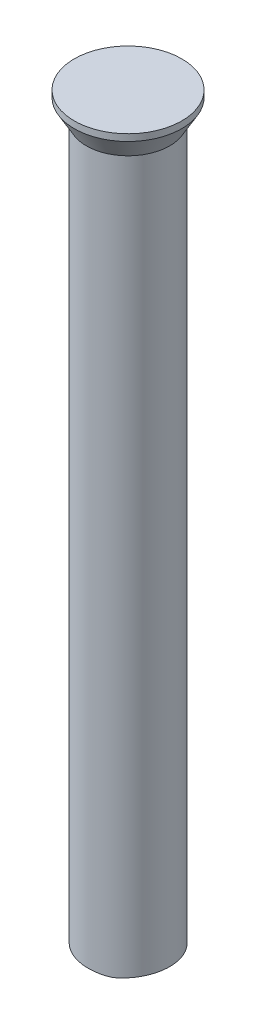
ISO-10303-21;
HEADER;
FILE_DESCRIPTION(('STEP AP214'),'2;1');
FILE_NAME('part.step','',(''),(''),'','','');
FILE_SCHEMA(('AUTOMOTIVE_DESIGN { 1 0 10303 214 1 1 1 1 }'));
ENDSEC;
DATA;
#1=APPLICATION_CONTEXT('core data for automotive mechanical design processes');
#2=APPLICATION_PROTOCOL_DEFINITION('international standard','automotive_design',2000,#1);
#3=PRODUCT_CONTEXT('',#1,'mechanical');
#4=PRODUCT('Part','Part','',(#3));
#5=PRODUCT_RELATED_PRODUCT_CATEGORY('part','',(#4));
#6=PRODUCT_DEFINITION_FORMATION('','',#4);
#7=PRODUCT_DEFINITION_CONTEXT('part definition',#1,'design');
#8=PRODUCT_DEFINITION('design','',#6,#7);
#9=PRODUCT_DEFINITION_SHAPE('','',#8);
#10=(LENGTH_UNIT() NAMED_UNIT(*) SI_UNIT(.MILLI.,.METRE.));
#11=(NAMED_UNIT(*) PLANE_ANGLE_UNIT() SI_UNIT($,.RADIAN.));
#12=(NAMED_UNIT(*) SI_UNIT($,.STERADIAN.) SOLID_ANGLE_UNIT());
#13=UNCERTAINTY_MEASURE_WITH_UNIT(LENGTH_MEASURE(1.E-05),#10,'distance_accuracy_value','');
#14=(GEOMETRIC_REPRESENTATION_CONTEXT(3) GLOBAL_UNCERTAINTY_ASSIGNED_CONTEXT((#13)) GLOBAL_UNIT_ASSIGNED_CONTEXT((#10,
#11,#12)) REPRESENTATION_CONTEXT('',''));
#15=CARTESIAN_POINT('',(0.,0.,0.));
#16=DIRECTION('',(0.,0.,1.));
#17=DIRECTION('',(1.,0.,0.));
#18=AXIS2_PLACEMENT_3D('',#15,#16,#17);
#19=CARTESIAN_POINT('',(0.,0.,0.));
#20=DIRECTION('',(0.,1.,0.));
#21=DIRECTION('',(0.,0.,1.));
#22=AXIS2_PLACEMENT_3D('',#19,#20,#21);
#23=PLANE('',#22);
#24=CARTESIAN_POINT('',(0.,0.,0.));
#25=DIRECTION('',(0.,-1.,0.));
#26=DIRECTION('',(0.,0.,-1.));
#27=AXIS2_PLACEMENT_3D('',#24,#25,#26);
#28=CIRCLE('',#27,4.);
#29=CARTESIAN_POINT('',(0.,0.,-4.));
#30=VERTEX_POINT('',#29);
#31=EDGE_CURVE('E71',#30,#30,#28,.T.);
#32=ORIENTED_EDGE('',*,*,#31,.F.);
#33=EDGE_LOOP('',(#32));
#34=FACE_BOUND('',#33,.T.);
#35=ADVANCED_FACE('F40',(#34),#23,.T.);
#36=CARTESIAN_POINT('',(0.,-60.2,0.));
#37=DIRECTION('',(0.,-1.,0.));
#38=DIRECTION('',(0.,0.,-1.));
#39=AXIS2_PLACEMENT_3D('',#36,#37,#38);
#40=CYLINDRICAL_SURFACE('',#39,4.);
#41=ORIENTED_EDGE('',*,*,#31,.T.);
#42=EDGE_LOOP('',(#41));
#43=FACE_BOUND('',#42,.T.);
#44=CARTESIAN_POINT('',(0.,-0.5,0.));
#45=DIRECTION('',(0.,-1.,0.));
#46=DIRECTION('',(0.,0.,-1.));
#47=AXIS2_PLACEMENT_3D('',#44,#45,#46);
#48=CIRCLE('',#47,4.);
#49=CARTESIAN_POINT('',(0.,-0.5,-4.));
#50=VERTEX_POINT('',#49);
#51=EDGE_CURVE('E80',#50,#50,#48,.T.);
#52=ORIENTED_EDGE('',*,*,#51,.F.);
#53=EDGE_LOOP('',(#52));
#54=FACE_BOUND('',#53,.T.);
#55=ADVANCED_FACE('F90',(#43,#54),#40,.T.);
#56=CARTESIAN_POINT('',(0.,-2.05884572681201,0.));
#57=DIRECTION('',(0.,1.,0.));
#58=DIRECTION('',(0.,0.,1.));
#59=AXIS2_PLACEMENT_3D('',#56,#57,#58);
#60=CONICAL_SURFACE('',#59,3.1,0.523598775598293);
#61=ORIENTED_EDGE('',*,*,#51,.T.);
#62=EDGE_LOOP('',(#61));
#63=FACE_BOUND('',#62,.T.);
#64=CARTESIAN_POINT('',(0.,-2.05884572681201,0.));
#65=DIRECTION('',(0.,-1.,0.));
#66=DIRECTION('',(0.,0.,-1.));
#67=AXIS2_PLACEMENT_3D('',#64,#65,#66);
#68=CIRCLE('',#67,3.1);
#69=CARTESIAN_POINT('',(0.,-2.05884572681201,-3.1));
#70=VERTEX_POINT('',#69);
#71=EDGE_CURVE('E77',#70,#70,#68,.T.);
#72=ORIENTED_EDGE('',*,*,#71,.F.);
#73=EDGE_LOOP('',(#72));
#74=FACE_BOUND('',#73,.T.);
#75=ADVANCED_FACE('F97',(#63,#74),#60,.T.);
#76=CARTESIAN_POINT('',(0.,-60.2,0.));
#77=DIRECTION('',(0.,-1.,0.));
#78=DIRECTION('',(0.,0.,-1.));
#79=AXIS2_PLACEMENT_3D('',#76,#77,#78);
#80=CYLINDRICAL_SURFACE('',#79,3.1);
#81=CARTESIAN_POINT('',(0.,-55.2,0.));
#82=DIRECTION('',(0.0435778713738263,0.996194698091746,-0.0754790873051677));
#83=DIRECTION('',(0.498097349045877,-0.0871557427476519,-0.862729915662819));
#84=AXIS2_PLACEMENT_3D('',#81,#82,#83);
#85=ELLIPSE('',#84,3.11184149638438,3.1);
#86=CARTESIAN_POINT('',(1.55,-55.0643925715348,2.68467875173177));
#87=VERTEX_POINT('',#86);
#88=CARTESIAN_POINT('',(-3.1,-55.0643925715348,0.));
#89=VERTEX_POINT('',#88);
#90=EDGE_CURVE('E61',#87,#89,#85,.F.);
#91=ORIENTED_EDGE('',*,*,#90,.F.);
#92=CARTESIAN_POINT('',(0.,-55.2,0.));
#93=DIRECTION('',(-0.0871557427476519,0.996194698091746,0.));
#94=DIRECTION('',(-0.996194698091746,-0.0871557427476519,0.));
#95=AXIS2_PLACEMENT_3D('',#92,#93,#94);
#96=ELLIPSE('',#95,3.11184149638438,3.1);
#97=CARTESIAN_POINT('',(1.55000000000001,-55.0643925715348,-2.68467875173176));
#98=VERTEX_POINT('',#97);
#99=EDGE_CURVE('E76',#98,#87,#96,.F.);
#100=ORIENTED_EDGE('',*,*,#99,.F.);
#101=CARTESIAN_POINT('',(0.,-55.2,0.));
#102=DIRECTION('',(0.0435778713738252,0.996194698091746,0.0754790873051683));
#103=DIRECTION('',(0.498097349045865,-0.0871557427476519,0.862729915662826));
#104=AXIS2_PLACEMENT_3D('',#101,#102,#103);
#105=ELLIPSE('',#104,3.11184149638438,3.1);
#106=EDGE_CURVE('E54',#89,#98,#105,.F.);
#107=ORIENTED_EDGE('',*,*,#106,.F.);
#108=EDGE_LOOP('',(#91,#100,#107));
#109=FACE_BOUND('',#108,.T.);
#110=ORIENTED_EDGE('',*,*,#71,.T.);
#111=EDGE_LOOP('',(#110));
#112=FACE_BOUND('',#111,.T.);
#113=ADVANCED_FACE('F101',(#109,#112),#80,.T.);
#114=CARTESIAN_POINT('',(3.1,-54.9287851430697,-4.));
#115=DIRECTION('',(-0.0871557427476519,0.996194698091746,0.));
#116=DIRECTION('',(-0.996194698091746,-0.0871557427476519,0.));
#117=AXIS2_PLACEMENT_3D('',#114,#115,#116);
#118=PLANE('',#117);
#119=ORIENTED_EDGE('',*,*,#99,.T.);
#120=DIRECTION('',(-0.499522293842326,-0.0437025378896658,-0.865197992448263));
#121=VECTOR('',#120,1.);
#122=CARTESIAN_POINT('',(-0.949302198285285,-55.2830531806102,-1.64423963916695));
#123=LINE('',#122,#121);
#124=CARTESIAN_POINT('',(0.,-55.2,0.));
#125=VERTEX_POINT('',#124);
#126=EDGE_CURVE('E11',#87,#125,#123,.T.);
#127=ORIENTED_EDGE('',*,*,#126,.T.);
#128=DIRECTION('',(0.499522293842331,0.0437025378896663,-0.865197992448259));
#129=VECTOR('',#128,1.);
#130=CARTESIAN_POINT('',(2.508183288239,-54.9805623962339,-4.34430088992507));
#131=LINE('',#130,#129);
#132=EDGE_CURVE('E47',#125,#98,#131,.T.);
#133=ORIENTED_EDGE('',*,*,#132,.T.);
#134=EDGE_LOOP('',(#119,#127,#133));
#135=FACE_BOUND('',#134,.T.);
#136=ADVANCED_FACE('F75',(#135),#118,.F.);
#137=CARTESIAN_POINT('',(3.18205080756886,-54.9287851430697,5.41672955930066));
#138=DIRECTION('',(0.0435778713738263,0.996194698091746,-0.0754790873051677));
#139=DIRECTION('',(0.,0.0755508581011249,0.997141949694317));
#140=AXIS2_PLACEMENT_3D('',#137,#138,#139);
#141=PLANE('',#140);
#142=ORIENTED_EDGE('',*,*,#90,.T.);
#143=DIRECTION('',(0.999044587684655,-0.0437025378896658,0.));
#144=VECTOR('',#143,1.);
#145=CARTESIAN_POINT('',(3.16413191785446,-55.3384128363564,0.));
#146=LINE('',#145,#144);
#147=EDGE_CURVE('E68',#89,#125,#146,.T.);
#148=ORIENTED_EDGE('',*,*,#147,.T.);
#149=ORIENTED_EDGE('',*,*,#126,.F.);
#150=EDGE_LOOP('',(#142,#148,#149));
#151=FACE_BOUND('',#150,.T.);
#152=ADVANCED_FACE('F73',(#151),#141,.F.);
#153=CARTESIAN_POINT('',(-6.28205080756887,-54.9287851430697,0.0473720558370502));
#154=DIRECTION('',(0.0435778713738252,0.996194698091746,0.0754790873051683));
#155=DIRECTION('',(0.,-0.0755508581011255,0.997141949694317));
#156=AXIS2_PLACEMENT_3D('',#153,#154,#155);
#157=PLANE('',#156);
#158=ORIENTED_EDGE('',*,*,#106,.T.);
#159=ORIENTED_EDGE('',*,*,#132,.F.);
#160=ORIENTED_EDGE('',*,*,#147,.F.);
#161=EDGE_LOOP('',(#158,#159,#160));
#162=FACE_BOUND('',#161,.T.);
#163=ADVANCED_FACE('F67',(#162),#157,.F.);
#164=CLOSED_SHELL('',(#35,#55,#75,#113,#136,#152,#163));
#165=MANIFOLD_SOLID_BREP('B2',#164);
#166=ADVANCED_BREP_SHAPE_REPRESENTATION('',(#18,#165),#14);
#167=SHAPE_DEFINITION_REPRESENTATION(#9,#166);
ENDSEC;
END-ISO-10303-21;
